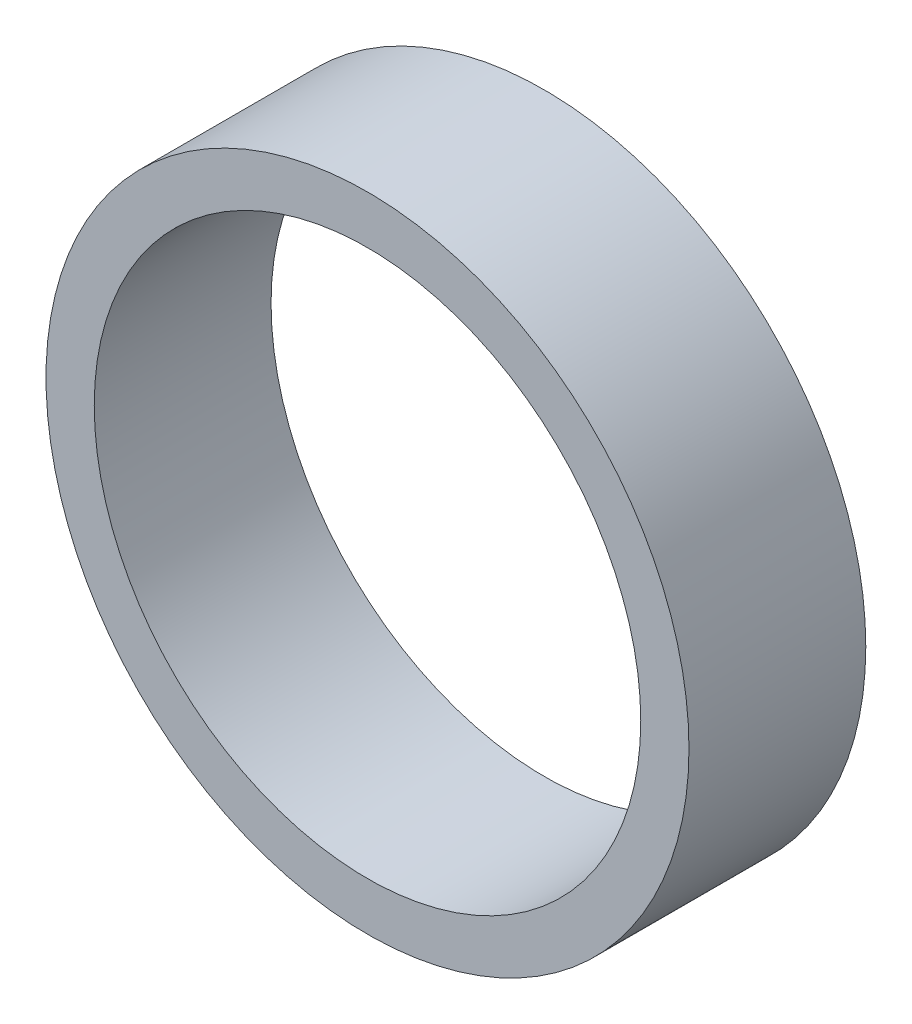
ISO-10303-21;
HEADER;
FILE_DESCRIPTION(('STEP AP214'),'2;1');
FILE_NAME('part.step','',(''),(''),'','','');
FILE_SCHEMA(('AUTOMOTIVE_DESIGN { 1 0 10303 214 1 1 1 1 }'));
ENDSEC;
DATA;
#1=APPLICATION_CONTEXT('core data for automotive mechanical design processes');
#2=APPLICATION_PROTOCOL_DEFINITION('international standard','automotive_design',2000,#1);
#3=PRODUCT_CONTEXT('',#1,'mechanical');
#4=PRODUCT('Part','Part','',(#3));
#5=PRODUCT_RELATED_PRODUCT_CATEGORY('part','',(#4));
#6=PRODUCT_DEFINITION_FORMATION('','',#4);
#7=PRODUCT_DEFINITION_CONTEXT('part definition',#1,'design');
#8=PRODUCT_DEFINITION('design','',#6,#7);
#9=PRODUCT_DEFINITION_SHAPE('','',#8);
#10=(LENGTH_UNIT() NAMED_UNIT(*) SI_UNIT(.MILLI.,.METRE.));
#11=(NAMED_UNIT(*) PLANE_ANGLE_UNIT() SI_UNIT($,.RADIAN.));
#12=(NAMED_UNIT(*) SI_UNIT($,.STERADIAN.) SOLID_ANGLE_UNIT());
#13=UNCERTAINTY_MEASURE_WITH_UNIT(LENGTH_MEASURE(1.E-05),#10,'distance_accuracy_value','');
#14=(GEOMETRIC_REPRESENTATION_CONTEXT(3) GLOBAL_UNCERTAINTY_ASSIGNED_CONTEXT((#13)) GLOBAL_UNIT_ASSIGNED_CONTEXT((#10,
#11,#12)) REPRESENTATION_CONTEXT('',''));
#15=CARTESIAN_POINT('',(0.,0.,0.));
#16=DIRECTION('',(0.,0.,1.));
#17=DIRECTION('',(1.,0.,0.));
#18=AXIS2_PLACEMENT_3D('',#15,#16,#17);
#19=CARTESIAN_POINT('',(0.,0.,22.));
#20=DIRECTION('',(0.,0.,1.));
#21=DIRECTION('',(1.,0.,0.));
#22=AXIS2_PLACEMENT_3D('',#19,#20,#21);
#23=PLANE('',#22);
#24=CARTESIAN_POINT('',(0.,0.,22.));
#25=DIRECTION('',(0.,0.,1.));
#26=DIRECTION('',(1.,0.,0.));
#27=AXIS2_PLACEMENT_3D('',#24,#25,#26);
#28=CIRCLE('',#27,40.);
#29=CARTESIAN_POINT('',(40.,0.,22.));
#30=VERTEX_POINT('',#29);
#31=EDGE_CURVE('E10',#30,#30,#28,.T.);
#32=ORIENTED_EDGE('',*,*,#31,.T.);
#33=EDGE_LOOP('',(#32));
#34=FACE_BOUND('',#33,.T.);
#35=CARTESIAN_POINT('',(0.,0.,22.));
#36=DIRECTION('',(0.,0.,1.));
#37=DIRECTION('',(1.,0.,0.));
#38=AXIS2_PLACEMENT_3D('',#35,#36,#37);
#39=CIRCLE('',#38,34.);
#40=CARTESIAN_POINT('',(34.,0.,22.));
#41=VERTEX_POINT('',#40);
#42=EDGE_CURVE('E56',#41,#41,#39,.T.);
#43=ORIENTED_EDGE('',*,*,#42,.F.);
#44=EDGE_LOOP('',(#43));
#45=FACE_BOUND('',#44,.T.);
#46=ADVANCED_FACE('F43',(#34,#45),#23,.T.);
#47=CARTESIAN_POINT('',(0.,0.,0.));
#48=DIRECTION('',(0.,0.,1.));
#49=DIRECTION('',(1.,0.,0.));
#50=AXIS2_PLACEMENT_3D('',#47,#48,#49);
#51=PLANE('',#50);
#52=CARTESIAN_POINT('',(0.,0.,0.));
#53=DIRECTION('',(0.,0.,1.));
#54=DIRECTION('',(1.,0.,0.));
#55=AXIS2_PLACEMENT_3D('',#52,#53,#54);
#56=CIRCLE('',#55,40.);
#57=CARTESIAN_POINT('',(40.,0.,0.));
#58=VERTEX_POINT('',#57);
#59=EDGE_CURVE('E47',#58,#58,#56,.T.);
#60=ORIENTED_EDGE('',*,*,#59,.F.);
#61=EDGE_LOOP('',(#60));
#62=FACE_BOUND('',#61,.T.);
#63=CARTESIAN_POINT('',(0.,0.,0.));
#64=DIRECTION('',(0.,0.,1.));
#65=DIRECTION('',(1.,0.,0.));
#66=AXIS2_PLACEMENT_3D('',#63,#64,#65);
#67=CIRCLE('',#66,34.);
#68=CARTESIAN_POINT('',(34.,0.,0.));
#69=VERTEX_POINT('',#68);
#70=EDGE_CURVE('E58',#69,#69,#67,.T.);
#71=ORIENTED_EDGE('',*,*,#70,.T.);
#72=EDGE_LOOP('',(#71));
#73=FACE_BOUND('',#72,.T.);
#74=ADVANCED_FACE('F70',(#62,#73),#51,.F.);
#75=CARTESIAN_POINT('',(0.,0.,22.));
#76=DIRECTION('',(0.,0.,-1.));
#77=DIRECTION('',(-1.,0.,0.));
#78=AXIS2_PLACEMENT_3D('',#75,#76,#77);
#79=CYLINDRICAL_SURFACE('',#78,40.);
#80=ORIENTED_EDGE('',*,*,#31,.F.);
#81=EDGE_LOOP('',(#80));
#82=FACE_BOUND('',#81,.T.);
#83=ORIENTED_EDGE('',*,*,#59,.T.);
#84=EDGE_LOOP('',(#83));
#85=FACE_BOUND('',#84,.T.);
#86=ADVANCED_FACE('F45',(#82,#85),#79,.T.);
#87=CARTESIAN_POINT('',(0.,0.,22.));
#88=DIRECTION('',(0.,0.,-1.));
#89=DIRECTION('',(-1.,0.,0.));
#90=AXIS2_PLACEMENT_3D('',#87,#88,#89);
#91=CYLINDRICAL_SURFACE('',#90,34.);
#92=ORIENTED_EDGE('',*,*,#42,.T.);
#93=EDGE_LOOP('',(#92));
#94=FACE_BOUND('',#93,.T.);
#95=ORIENTED_EDGE('',*,*,#70,.F.);
#96=EDGE_LOOP('',(#95));
#97=FACE_BOUND('',#96,.T.);
#98=ADVANCED_FACE('F66',(#94,#97),#91,.F.);
#99=CLOSED_SHELL('',(#46,#74,#86,#98));
#100=MANIFOLD_SOLID_BREP('B2',#99);
#101=ADVANCED_BREP_SHAPE_REPRESENTATION('',(#18,#100),#14);
#102=SHAPE_DEFINITION_REPRESENTATION(#9,#101);
ENDSEC;
END-ISO-10303-21;
